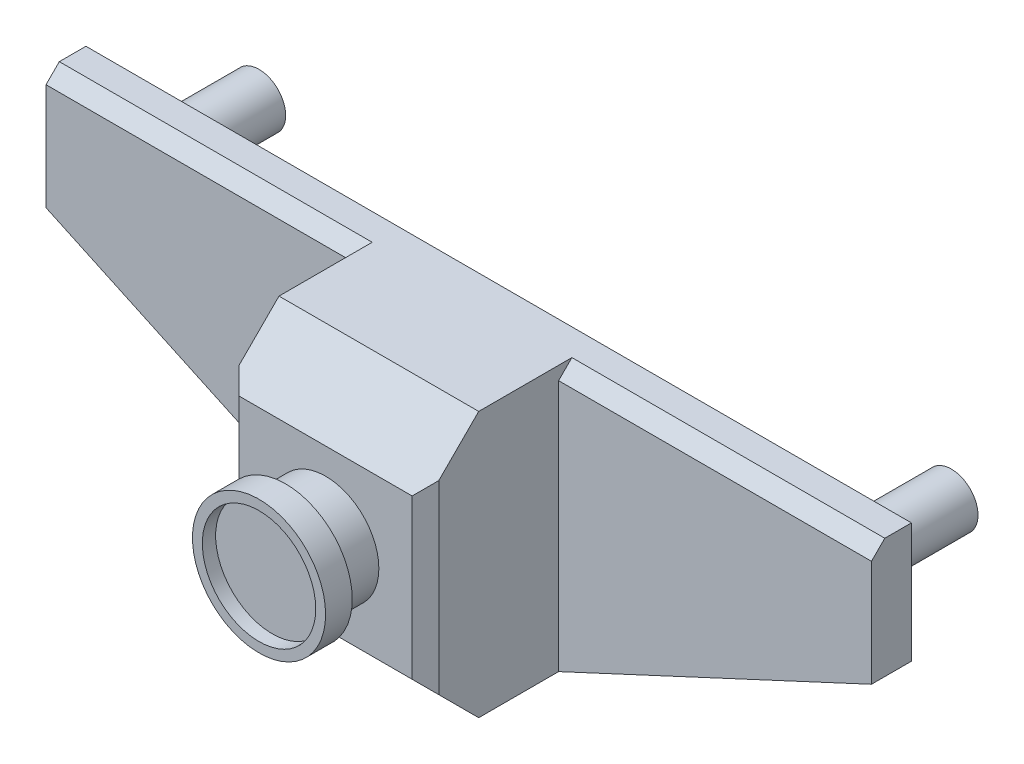
ISO-10303-21;
HEADER;
FILE_DESCRIPTION(('STEP AP214'),'2;1');
FILE_NAME('part.step','',(''),(''),'','','');
FILE_SCHEMA(('AUTOMOTIVE_DESIGN { 1 0 10303 214 1 1 1 1 }'));
ENDSEC;
DATA;
#1=APPLICATION_CONTEXT('core data for automotive mechanical design processes');
#2=APPLICATION_PROTOCOL_DEFINITION('international standard','automotive_design',2000,#1);
#3=PRODUCT_CONTEXT('',#1,'mechanical');
#4=PRODUCT('Part','Part','',(#3));
#5=PRODUCT_RELATED_PRODUCT_CATEGORY('part','',(#4));
#6=PRODUCT_DEFINITION_FORMATION('','',#4);
#7=PRODUCT_DEFINITION_CONTEXT('part definition',#1,'design');
#8=PRODUCT_DEFINITION('design','',#6,#7);
#9=PRODUCT_DEFINITION_SHAPE('','',#8);
#10=(LENGTH_UNIT() NAMED_UNIT(*) SI_UNIT(.MILLI.,.METRE.));
#11=(NAMED_UNIT(*) PLANE_ANGLE_UNIT() SI_UNIT($,.RADIAN.));
#12=(NAMED_UNIT(*) SI_UNIT($,.STERADIAN.) SOLID_ANGLE_UNIT());
#13=UNCERTAINTY_MEASURE_WITH_UNIT(LENGTH_MEASURE(1.E-05),#10,'distance_accuracy_value','');
#14=(GEOMETRIC_REPRESENTATION_CONTEXT(3) GLOBAL_UNCERTAINTY_ASSIGNED_CONTEXT((#13)) GLOBAL_UNIT_ASSIGNED_CONTEXT((#10,
#11,#12)) REPRESENTATION_CONTEXT('',''));
#15=CARTESIAN_POINT('',(0.,0.,0.));
#16=DIRECTION('',(0.,0.,1.));
#17=DIRECTION('',(1.,0.,0.));
#18=AXIS2_PLACEMENT_3D('',#15,#16,#17);
#19=CARTESIAN_POINT('',(0.,0.,3.));
#20=DIRECTION('',(0.,0.,1.));
#21=DIRECTION('',(1.,0.,0.));
#22=AXIS2_PLACEMENT_3D('',#19,#20,#21);
#23=PLANE('',#22);
#24=DIRECTION('',(0.,-1.,0.));
#25=VECTOR('',#24,1.);
#26=CARTESIAN_POINT('',(7.98924665609624,-14.2222222222222,3.));
#27=LINE('',#26,#25);
#28=CARTESIAN_POINT('',(7.98924665609624,4.70370370370372,3.));
#29=VERTEX_POINT('',#28);
#30=CARTESIAN_POINT('',(7.98924665609624,-14.2222222222222,3.));
#31=VERTEX_POINT('',#30);
#32=EDGE_CURVE('E237',#29,#31,#27,.T.);
#33=ORIENTED_EDGE('',*,*,#32,.F.);
#34=DIRECTION('',(-1.,0.,0.));
#35=VECTOR('',#34,1.);
#36=CARTESIAN_POINT('',(-15.5107533439038,4.70370370370372,3.));
#37=LINE('',#36,#35);
#38=CARTESIAN_POINT('',(-15.5107533439038,4.70370370370372,3.));
#39=VERTEX_POINT('',#38);
#40=EDGE_CURVE('E156',#29,#39,#37,.T.);
#41=ORIENTED_EDGE('',*,*,#40,.T.);
#42=DIRECTION('',(0.,-1.,0.));
#43=VECTOR('',#42,1.);
#44=CARTESIAN_POINT('',(-15.5107533439038,5.70370370370371,3.));
#45=LINE('',#44,#43);
#46=CARTESIAN_POINT('',(-15.5107533439038,-3.29629629629629,3.));
#47=VERTEX_POINT('',#46);
#48=EDGE_CURVE('E150',#39,#47,#45,.T.);
#49=ORIENTED_EDGE('',*,*,#48,.T.);
#50=DIRECTION('',(0.906784646843196,-0.421594122645774,0.));
#51=VECTOR('',#50,1.);
#52=CARTESIAN_POINT('',(-15.5107533439038,-3.29629629629629,3.));
#53=LINE('',#52,#51);
#54=EDGE_CURVE('E153',#47,#31,#53,.T.);
#55=ORIENTED_EDGE('',*,*,#54,.T.);
#56=EDGE_LOOP('',(#33,#41,#49,#55));
#57=FACE_BOUND('',#56,.T.);
#58=ADVANCED_FACE('F39',(#57),#23,.T.);
#59=CARTESIAN_POINT('',(-15.5107533439038,5.70370370370371,3.));
#60=DIRECTION('',(1.,0.,0.));
#61=DIRECTION('',(0.,0.,-1.));
#62=AXIS2_PLACEMENT_3D('',#59,#60,#61);
#63=PLANE('',#62);
#64=ORIENTED_EDGE('',*,*,#48,.F.);
#65=DIRECTION('',(0.,0.707106781186545,-0.70710678118655));
#66=VECTOR('',#65,1.);
#67=CARTESIAN_POINT('',(-15.5107533439038,4.70370370370372,3.));
#68=LINE('',#67,#66);
#69=CARTESIAN_POINT('',(-15.5107533439038,5.70370370370371,2.));
#70=VERTEX_POINT('',#69);
#71=EDGE_CURVE('E224',#39,#70,#68,.T.);
#72=ORIENTED_EDGE('',*,*,#71,.T.);
#73=DIRECTION('',(0.,0.,-1.));
#74=VECTOR('',#73,1.);
#75=CARTESIAN_POINT('',(-15.5107533439038,5.70370370370371,3.));
#76=LINE('',#75,#74);
#77=CARTESIAN_POINT('',(-15.5107533439038,5.70370370370371,0.));
#78=VERTEX_POINT('',#77);
#79=EDGE_CURVE('E248',#70,#78,#76,.T.);
#80=ORIENTED_EDGE('',*,*,#79,.T.);
#81=DIRECTION('',(0.,-1.,0.));
#82=VECTOR('',#81,1.);
#83=CARTESIAN_POINT('',(-15.5107533439038,5.70370370370371,0.));
#84=LINE('',#83,#82);
#85=CARTESIAN_POINT('',(-15.5107533439038,-3.29629629629629,0.));
#86=VERTEX_POINT('',#85);
#87=EDGE_CURVE('E172',#78,#86,#84,.T.);
#88=ORIENTED_EDGE('',*,*,#87,.T.);
#89=DIRECTION('',(0.,0.,-1.));
#90=VECTOR('',#89,1.);
#91=CARTESIAN_POINT('',(-15.5107533439038,-3.29629629629629,3.));
#92=LINE('',#91,#90);
#93=EDGE_CURVE('E164',#47,#86,#92,.T.);
#94=ORIENTED_EDGE('',*,*,#93,.F.);
#95=EDGE_LOOP('',(#64,#72,#80,#88,#94));
#96=FACE_BOUND('',#95,.T.);
#97=ADVANCED_FACE('F170',(#96),#63,.F.);
#98=CARTESIAN_POINT('',(-15.5107533439038,-3.29629629629629,3.));
#99=DIRECTION('',(0.421594122645774,0.906784646843196,0.));
#100=DIRECTION('',(-0.906784646843196,0.421594122645774,0.));
#101=AXIS2_PLACEMENT_3D('',#98,#99,#100);
#102=PLANE('',#101);
#103=DIRECTION('',(0.906784646843196,-0.421594122645774,0.));
#104=VECTOR('',#103,1.);
#105=CARTESIAN_POINT('',(-15.5107533439038,-3.29629629629629,0.));
#106=LINE('',#105,#104);
#107=CARTESIAN_POINT('',(7.98924665609624,-14.2222222222222,0.));
#108=VERTEX_POINT('',#107);
#109=EDGE_CURVE('E281',#86,#108,#106,.T.);
#110=ORIENTED_EDGE('',*,*,#109,.T.);
#111=DIRECTION('',(0.,0.,-1.));
#112=VECTOR('',#111,1.);
#113=CARTESIAN_POINT('',(7.98924665609624,-14.2222222222222,3.));
#114=LINE('',#113,#112);
#115=EDGE_CURVE('E167',#31,#108,#114,.T.);
#116=ORIENTED_EDGE('',*,*,#115,.F.);
#117=ORIENTED_EDGE('',*,*,#54,.F.);
#118=ORIENTED_EDGE('',*,*,#93,.T.);
#119=EDGE_LOOP('',(#110,#116,#117,#118));
#120=FACE_BOUND('',#119,.T.);
#121=ADVANCED_FACE('F163',(#120),#102,.F.);
#122=CARTESIAN_POINT('',(7.98924665609624,-14.2222222222222,3.));
#123=DIRECTION('',(0.,1.,0.));
#124=DIRECTION('',(-1.,0.,0.));
#125=AXIS2_PLACEMENT_3D('',#122,#123,#124);
#126=PLANE('',#125);
#127=DIRECTION('',(0.,0.,-1.));
#128=VECTOR('',#127,1.);
#129=CARTESIAN_POINT('',(22.9892466560962,-14.2222222222222,13.));
#130=LINE('',#129,#128);
#131=CARTESIAN_POINT('',(22.9892466560962,-14.2222222222222,9.00000000000001));
#132=VERTEX_POINT('',#131);
#133=CARTESIAN_POINT('',(22.9892466560962,-14.2222222222222,3.));
#134=VERTEX_POINT('',#133);
#135=EDGE_CURVE('E295',#132,#134,#130,.T.);
#136=ORIENTED_EDGE('',*,*,#135,.F.);
#137=DIRECTION('',(-1.,0.,0.));
#138=VECTOR('',#137,1.);
#139=CARTESIAN_POINT('',(7.98924665609624,-14.2222222222222,9.00000000000001));
#140=LINE('',#139,#138);
#141=CARTESIAN_POINT('',(7.98924665609624,-14.2222222222222,9.00000000000001));
#142=VERTEX_POINT('',#141);
#143=EDGE_CURVE('E195',#132,#142,#140,.T.);
#144=ORIENTED_EDGE('',*,*,#143,.T.);
#145=DIRECTION('',(0.,0.,-1.));
#146=VECTOR('',#145,1.);
#147=CARTESIAN_POINT('',(7.98924665609624,-14.2222222222222,13.));
#148=LINE('',#147,#146);
#149=EDGE_CURVE('E293',#142,#31,#148,.T.);
#150=ORIENTED_EDGE('',*,*,#149,.T.);
#151=ORIENTED_EDGE('',*,*,#115,.T.);
#152=DIRECTION('',(1.,0.,0.));
#153=VECTOR('',#152,1.);
#154=CARTESIAN_POINT('',(7.98924665609624,-14.2222222222222,0.));
#155=LINE('',#154,#153);
#156=CARTESIAN_POINT('',(22.9892466560962,-14.2222222222222,0.));
#157=VERTEX_POINT('',#156);
#158=EDGE_CURVE('E277',#108,#157,#155,.T.);
#159=ORIENTED_EDGE('',*,*,#158,.T.);
#160=DIRECTION('',(0.,0.,-1.));
#161=VECTOR('',#160,1.);
#162=CARTESIAN_POINT('',(22.9892466560962,-14.2222222222222,3.));
#163=LINE('',#162,#161);
#164=EDGE_CURVE('E178',#134,#157,#163,.T.);
#165=ORIENTED_EDGE('',*,*,#164,.F.);
#166=EDGE_LOOP('',(#136,#144,#150,#151,#159,#165));
#167=FACE_BOUND('',#166,.T.);
#168=ADVANCED_FACE('F367',(#167),#126,.F.);
#169=CARTESIAN_POINT('',(22.9892466560962,-14.2222222222222,3.));
#170=DIRECTION('',(-0.421594122645774,0.906784646843196,0.));
#171=DIRECTION('',(-0.906784646843196,-0.421594122645774,0.));
#172=AXIS2_PLACEMENT_3D('',#169,#170,#171);
#173=PLANE('',#172);
#174=DIRECTION('',(0.906784646843196,0.421594122645774,0.));
#175=VECTOR('',#174,1.);
#176=CARTESIAN_POINT('',(22.9892466560962,-14.2222222222222,0.));
#177=LINE('',#176,#175);
#178=CARTESIAN_POINT('',(46.4892466560962,-3.29629629629629,0.));
#179=VERTEX_POINT('',#178);
#180=EDGE_CURVE('E270',#157,#179,#177,.T.);
#181=ORIENTED_EDGE('',*,*,#180,.T.);
#182=DIRECTION('',(0.,0.,-1.));
#183=VECTOR('',#182,1.);
#184=CARTESIAN_POINT('',(46.4892466560962,-3.29629629629629,3.));
#185=LINE('',#184,#183);
#186=CARTESIAN_POINT('',(46.4892466560962,-3.29629629629629,3.));
#187=VERTEX_POINT('',#186);
#188=EDGE_CURVE('E256',#187,#179,#185,.T.);
#189=ORIENTED_EDGE('',*,*,#188,.F.);
#190=DIRECTION('',(0.906784646843196,0.421594122645774,0.));
#191=VECTOR('',#190,1.);
#192=CARTESIAN_POINT('',(22.9892466560962,-14.2222222222222,3.));
#193=LINE('',#192,#191);
#194=EDGE_CURVE('E168',#134,#187,#193,.T.);
#195=ORIENTED_EDGE('',*,*,#194,.F.);
#196=ORIENTED_EDGE('',*,*,#164,.T.);
#197=EDGE_LOOP('',(#181,#189,#195,#196));
#198=FACE_BOUND('',#197,.T.);
#199=ADVANCED_FACE('F268',(#198),#173,.F.);
#200=CARTESIAN_POINT('',(46.4892466560962,5.70370370370371,3.));
#201=DIRECTION('',(-1.,0.,0.));
#202=DIRECTION('',(0.,0.,1.));
#203=AXIS2_PLACEMENT_3D('',#200,#201,#202);
#204=PLANE('',#203);
#205=DIRECTION('',(0.,0.,-1.));
#206=VECTOR('',#205,1.);
#207=CARTESIAN_POINT('',(46.4892466560962,5.70370370370371,3.));
#208=LINE('',#207,#206);
#209=CARTESIAN_POINT('',(46.4892466560962,5.70370370370371,2.));
#210=VERTEX_POINT('',#209);
#211=CARTESIAN_POINT('',(46.4892466560962,5.70370370370371,0.));
#212=VERTEX_POINT('',#211);
#213=EDGE_CURVE('E253',#210,#212,#208,.T.);
#214=ORIENTED_EDGE('',*,*,#213,.F.);
#215=DIRECTION('',(0.,-0.707106781186545,0.70710678118655));
#216=VECTOR('',#215,1.);
#217=CARTESIAN_POINT('',(46.4892466560962,4.70370370370372,3.));
#218=LINE('',#217,#216);
#219=CARTESIAN_POINT('',(46.4892466560962,4.70370370370372,3.));
#220=VERTEX_POINT('',#219);
#221=EDGE_CURVE('E55',#210,#220,#218,.T.);
#222=ORIENTED_EDGE('',*,*,#221,.T.);
#223=DIRECTION('',(0.,1.,0.));
#224=VECTOR('',#223,1.);
#225=CARTESIAN_POINT('',(46.4892466560962,5.70370370370371,3.));
#226=LINE('',#225,#224);
#227=EDGE_CURVE('E254',#187,#220,#226,.T.);
#228=ORIENTED_EDGE('',*,*,#227,.F.);
#229=ORIENTED_EDGE('',*,*,#188,.T.);
#230=DIRECTION('',(0.,1.,0.));
#231=VECTOR('',#230,1.);
#232=CARTESIAN_POINT('',(46.4892466560962,5.70370370370371,0.));
#233=LINE('',#232,#231);
#234=EDGE_CURVE('E279',#179,#212,#233,.T.);
#235=ORIENTED_EDGE('',*,*,#234,.T.);
#236=EDGE_LOOP('',(#214,#222,#228,#229,#235));
#237=FACE_BOUND('',#236,.T.);
#238=ADVANCED_FACE('F363',(#237),#204,.F.);
#239=CARTESIAN_POINT('',(-15.5107533439038,5.70370370370371,3.));
#240=DIRECTION('',(0.,-1.,0.));
#241=DIRECTION('',(0.,0.,-1.));
#242=AXIS2_PLACEMENT_3D('',#239,#240,#241);
#243=PLANE('',#242);
#244=ORIENTED_EDGE('',*,*,#79,.F.);
#245=DIRECTION('',(1.,0.,0.));
#246=VECTOR('',#245,1.);
#247=CARTESIAN_POINT('',(7.98924665609624,5.70370370370371,2.));
#248=LINE('',#247,#246);
#249=CARTESIAN_POINT('',(7.98924665609624,5.70370370370371,2.));
#250=VERTEX_POINT('',#249);
#251=EDGE_CURVE('E228',#70,#250,#248,.T.);
#252=ORIENTED_EDGE('',*,*,#251,.T.);
#253=DIRECTION('',(0.,0.,-1.));
#254=VECTOR('',#253,1.);
#255=CARTESIAN_POINT('',(7.98924665609624,5.70370370370371,13.));
#256=LINE('',#255,#254);
#257=CARTESIAN_POINT('',(7.98924665609624,5.70370370370371,9.00000000000001));
#258=VERTEX_POINT('',#257);
#259=EDGE_CURVE('E240',#258,#250,#256,.T.);
#260=ORIENTED_EDGE('',*,*,#259,.F.);
#261=DIRECTION('',(1.,0.,0.));
#262=VECTOR('',#261,1.);
#263=CARTESIAN_POINT('',(-15.5107533439038,5.70370370370371,9.00000000000001));
#264=LINE('',#263,#262);
#265=CARTESIAN_POINT('',(22.9892466560962,5.70370370370371,9.00000000000001));
#266=VERTEX_POINT('',#265);
#267=EDGE_CURVE('E202',#258,#266,#264,.T.);
#268=ORIENTED_EDGE('',*,*,#267,.T.);
#269=DIRECTION('',(0.,0.,-1.));
#270=VECTOR('',#269,1.);
#271=CARTESIAN_POINT('',(22.9892466560962,5.70370370370371,13.));
#272=LINE('',#271,#270);
#273=CARTESIAN_POINT('',(22.9892466560962,5.70370370370371,2.));
#274=VERTEX_POINT('',#273);
#275=EDGE_CURVE('E297',#266,#274,#272,.T.);
#276=ORIENTED_EDGE('',*,*,#275,.T.);
#277=DIRECTION('',(1.,0.,0.));
#278=VECTOR('',#277,1.);
#279=CARTESIAN_POINT('',(46.4892466560962,5.70370370370371,2.));
#280=LINE('',#279,#278);
#281=EDGE_CURVE('E226',#274,#210,#280,.T.);
#282=ORIENTED_EDGE('',*,*,#281,.T.);
#283=ORIENTED_EDGE('',*,*,#213,.T.);
#284=DIRECTION('',(-1.,0.,0.));
#285=VECTOR('',#284,1.);
#286=CARTESIAN_POINT('',(-15.5107533439038,5.70370370370371,0.));
#287=LINE('',#286,#285);
#288=EDGE_CURVE('E159',#212,#78,#287,.T.);
#289=ORIENTED_EDGE('',*,*,#288,.T.);
#290=EDGE_LOOP('',(#244,#252,#260,#268,#276,#282,#283,#289));
#291=FACE_BOUND('',#290,.T.);
#292=ADVANCED_FACE('F251',(#291),#243,.F.);
#293=ORIENTED_EDGE('',*,*,#227,.T.);
#294=DIRECTION('',(-1.,0.,0.));
#295=VECTOR('',#294,1.);
#296=CARTESIAN_POINT('',(22.9892466560962,4.70370370370372,3.));
#297=LINE('',#296,#295);
#298=CARTESIAN_POINT('',(22.9892466560962,4.70370370370372,3.));
#299=VERTEX_POINT('',#298);
#300=EDGE_CURVE('E231',#220,#299,#297,.T.);
#301=ORIENTED_EDGE('',*,*,#300,.T.);
#302=DIRECTION('',(0.,1.,0.));
#303=VECTOR('',#302,1.);
#304=CARTESIAN_POINT('',(22.9892466560962,-14.2222222222222,3.));
#305=LINE('',#304,#303);
#306=EDGE_CURVE('E243',#134,#299,#305,.T.);
#307=ORIENTED_EDGE('',*,*,#306,.F.);
#308=ORIENTED_EDGE('',*,*,#194,.T.);
#309=EDGE_LOOP('',(#293,#301,#307,#308));
#310=FACE_BOUND('',#309,.T.);
#311=ADVANCED_FACE('F348',(#310),#23,.T.);
#312=CARTESIAN_POINT('',(0.,0.,0.));
#313=DIRECTION('',(0.,0.,1.));
#314=DIRECTION('',(1.,0.,0.));
#315=AXIS2_PLACEMENT_3D('',#312,#313,#314);
#316=PLANE('',#315);
#317=CARTESIAN_POINT('',(-10.5107533439038,0.703703703703711,0.));
#318=DIRECTION('',(0.,0.,1.));
#319=DIRECTION('',(1.,0.,0.));
#320=AXIS2_PLACEMENT_3D('',#317,#318,#319);
#321=CIRCLE('',#320,2.);
#322=CARTESIAN_POINT('',(-8.51075334390375,0.703703703703711,0.));
#323=VERTEX_POINT('',#322);
#324=EDGE_CURVE('E176',#323,#323,#321,.F.);
#325=ORIENTED_EDGE('',*,*,#324,.F.);
#326=EDGE_LOOP('',(#325));
#327=FACE_BOUND('',#326,.T.);
#328=CARTESIAN_POINT('',(41.4892466560962,0.703703703703711,0.));
#329=DIRECTION('',(0.,0.,1.));
#330=DIRECTION('',(1.,0.,0.));
#331=AXIS2_PLACEMENT_3D('',#328,#329,#330);
#332=CIRCLE('',#331,2.);
#333=CARTESIAN_POINT('',(43.4892466560962,0.703703703703711,0.));
#334=VERTEX_POINT('',#333);
#335=EDGE_CURVE('E173',#334,#334,#332,.F.);
#336=ORIENTED_EDGE('',*,*,#335,.F.);
#337=EDGE_LOOP('',(#336));
#338=FACE_BOUND('',#337,.T.);
#339=ORIENTED_EDGE('',*,*,#87,.F.);
#340=ORIENTED_EDGE('',*,*,#288,.F.);
#341=ORIENTED_EDGE('',*,*,#234,.F.);
#342=ORIENTED_EDGE('',*,*,#180,.F.);
#343=ORIENTED_EDGE('',*,*,#158,.F.);
#344=ORIENTED_EDGE('',*,*,#109,.F.);
#345=EDGE_LOOP('',(#339,#340,#341,#342,#343,#344));
#346=FACE_BOUND('',#345,.T.);
#347=ADVANCED_FACE('F276',(#327,#338,#346),#316,.F.);
#348=CARTESIAN_POINT('',(41.4892466560962,0.703703703703711,-8.));
#349=DIRECTION('',(0.,0.,1.));
#350=DIRECTION('',(1.,0.,0.));
#351=AXIS2_PLACEMENT_3D('',#348,#349,#350);
#352=CYLINDRICAL_SURFACE('',#351,2.);
#353=CARTESIAN_POINT('',(41.4892466560962,0.703703703703711,-8.));
#354=DIRECTION('',(0.,0.,-1.));
#355=DIRECTION('',(-1.,0.,0.));
#356=AXIS2_PLACEMENT_3D('',#353,#354,#355);
#357=CIRCLE('',#356,2.);
#358=CARTESIAN_POINT('',(39.4892466560962,0.703703703703711,-8.));
#359=VERTEX_POINT('',#358);
#360=EDGE_CURVE('E285',#359,#359,#357,.T.);
#361=ORIENTED_EDGE('',*,*,#360,.F.);
#362=EDGE_LOOP('',(#361));
#363=FACE_BOUND('',#362,.T.);
#364=ORIENTED_EDGE('',*,*,#335,.T.);
#365=EDGE_LOOP('',(#364));
#366=FACE_BOUND('',#365,.T.);
#367=ADVANCED_FACE('F361',(#363,#366),#352,.T.);
#368=CARTESIAN_POINT('',(41.4892466560962,0.703703703703711,-8.));
#369=DIRECTION('',(0.,0.,-1.));
#370=DIRECTION('',(-1.,0.,0.));
#371=AXIS2_PLACEMENT_3D('',#368,#369,#370);
#372=PLANE('',#371);
#373=ORIENTED_EDGE('',*,*,#360,.T.);
#374=EDGE_LOOP('',(#373));
#375=FACE_BOUND('',#374,.T.);
#376=ADVANCED_FACE('F535',(#375),#372,.T.);
#377=CARTESIAN_POINT('',(-10.5107533439038,0.703703703703711,-8.));
#378=DIRECTION('',(0.,0.,1.));
#379=DIRECTION('',(1.,0.,0.));
#380=AXIS2_PLACEMENT_3D('',#377,#378,#379);
#381=CYLINDRICAL_SURFACE('',#380,2.);
#382=CARTESIAN_POINT('',(-10.5107533439038,0.703703703703711,-8.));
#383=DIRECTION('',(0.,0.,-1.));
#384=DIRECTION('',(-1.,0.,0.));
#385=AXIS2_PLACEMENT_3D('',#382,#383,#384);
#386=CIRCLE('',#385,2.);
#387=CARTESIAN_POINT('',(-12.5107533439038,0.703703703703711,-8.));
#388=VERTEX_POINT('',#387);
#389=EDGE_CURVE('E290',#388,#388,#386,.T.);
#390=ORIENTED_EDGE('',*,*,#389,.F.);
#391=EDGE_LOOP('',(#390));
#392=FACE_BOUND('',#391,.T.);
#393=ORIENTED_EDGE('',*,*,#324,.T.);
#394=EDGE_LOOP('',(#393));
#395=FACE_BOUND('',#394,.T.);
#396=ADVANCED_FACE('F524',(#392,#395),#381,.T.);
#397=CARTESIAN_POINT('',(-10.5107533439038,0.703703703703711,-8.));
#398=DIRECTION('',(0.,0.,-1.));
#399=DIRECTION('',(-1.,0.,0.));
#400=AXIS2_PLACEMENT_3D('',#397,#398,#399);
#401=PLANE('',#400);
#402=ORIENTED_EDGE('',*,*,#389,.T.);
#403=EDGE_LOOP('',(#402));
#404=FACE_BOUND('',#403,.T.);
#405=ADVANCED_FACE('F519',(#404),#401,.T.);
#406=CARTESIAN_POINT('',(7.98924665609624,-14.2222222222222,13.));
#407=DIRECTION('',(1.,0.,0.));
#408=DIRECTION('',(0.,0.,-1.));
#409=AXIS2_PLACEMENT_3D('',#406,#407,#408);
#410=PLANE('',#409);
#411=DIRECTION('',(0.,-0.707106781186547,-0.707106781186548));
#412=VECTOR('',#411,1.);
#413=CARTESIAN_POINT('',(7.98924665609624,-10.2222222222222,13.));
#414=LINE('',#413,#412);
#415=CARTESIAN_POINT('',(7.98924665609624,-11.2222222222223,12.));
#416=VERTEX_POINT('',#415);
#417=EDGE_CURVE('E199',#142,#416,#414,.F.);
#418=ORIENTED_EDGE('',*,*,#417,.T.);
#419=DIRECTION('',(0.,1.,0.));
#420=VECTOR('',#419,1.);
#421=CARTESIAN_POINT('',(7.98924665609624,-14.2222222222222,12.));
#422=LINE('',#421,#420);
#423=CARTESIAN_POINT('',(7.98924665609624,2.70370370370373,12.));
#424=VERTEX_POINT('',#423);
#425=EDGE_CURVE('E220',#416,#424,#422,.T.);
#426=ORIENTED_EDGE('',*,*,#425,.T.);
#427=DIRECTION('',(0.,-0.707106781186547,0.707106781186548));
#428=VECTOR('',#427,1.);
#429=CARTESIAN_POINT('',(7.98924665609624,1.70370370370372,13.));
#430=LINE('',#429,#428);
#431=EDGE_CURVE('E197',#424,#258,#430,.F.);
#432=ORIENTED_EDGE('',*,*,#431,.T.);
#433=ORIENTED_EDGE('',*,*,#259,.T.);
#434=DIRECTION('',(0.,-0.707106781186545,0.70710678118655));
#435=VECTOR('',#434,1.);
#436=CARTESIAN_POINT('',(7.98924665609624,-9.7592592592592,17.462962962963));
#437=LINE('',#436,#435);
#438=EDGE_CURVE('E48',#250,#29,#437,.T.);
#439=ORIENTED_EDGE('',*,*,#438,.T.);
#440=ORIENTED_EDGE('',*,*,#32,.T.);
#441=ORIENTED_EDGE('',*,*,#149,.F.);
#442=EDGE_LOOP('',(#418,#426,#432,#433,#439,#440,#441));
#443=FACE_BOUND('',#442,.T.);
#444=ADVANCED_FACE('F235',(#443),#410,.F.);
#445=CARTESIAN_POINT('',(22.9892466560962,-14.2222222222222,13.));
#446=DIRECTION('',(-1.,0.,0.));
#447=DIRECTION('',(0.,0.,1.));
#448=AXIS2_PLACEMENT_3D('',#445,#446,#447);
#449=PLANE('',#448);
#450=DIRECTION('',(0.,0.707106781186547,-0.707106781186548));
#451=VECTOR('',#450,1.);
#452=CARTESIAN_POINT('',(22.9892466560962,1.70370370370372,13.));
#453=LINE('',#452,#451);
#454=CARTESIAN_POINT('',(22.9892466560962,2.70370370370373,12.));
#455=VERTEX_POINT('',#454);
#456=EDGE_CURVE('E190',#266,#455,#453,.F.);
#457=ORIENTED_EDGE('',*,*,#456,.T.);
#458=DIRECTION('',(0.,-1.,0.));
#459=VECTOR('',#458,1.);
#460=CARTESIAN_POINT('',(22.9892466560962,-14.2222222222222,12.));
#461=LINE('',#460,#459);
#462=CARTESIAN_POINT('',(22.9892466560962,-11.2222222222223,12.));
#463=VERTEX_POINT('',#462);
#464=EDGE_CURVE('E214',#455,#463,#461,.T.);
#465=ORIENTED_EDGE('',*,*,#464,.T.);
#466=DIRECTION('',(0.,0.707106781186547,0.707106781186548));
#467=VECTOR('',#466,1.);
#468=CARTESIAN_POINT('',(22.9892466560962,-10.2222222222222,13.));
#469=LINE('',#468,#467);
#470=EDGE_CURVE('E193',#463,#132,#469,.F.);
#471=ORIENTED_EDGE('',*,*,#470,.T.);
#472=ORIENTED_EDGE('',*,*,#135,.T.);
#473=ORIENTED_EDGE('',*,*,#306,.T.);
#474=DIRECTION('',(0.,0.707106781186545,-0.70710678118655));
#475=VECTOR('',#474,1.);
#476=CARTESIAN_POINT('',(22.9892466560962,-9.7592592592592,17.462962962963));
#477=LINE('',#476,#475);
#478=EDGE_CURVE('E11',#299,#274,#477,.T.);
#479=ORIENTED_EDGE('',*,*,#478,.T.);
#480=ORIENTED_EDGE('',*,*,#275,.F.);
#481=EDGE_LOOP('',(#457,#465,#471,#472,#473,#479,#480));
#482=FACE_BOUND('',#481,.T.);
#483=ADVANCED_FACE('F389',(#482),#449,.F.);
#484=CARTESIAN_POINT('',(0.,0.,13.));
#485=DIRECTION('',(0.,0.,-1.));
#486=DIRECTION('',(-1.,0.,0.));
#487=AXIS2_PLACEMENT_3D('',#484,#485,#486);
#488=PLANE('',#487);
#489=CARTESIAN_POINT('',(15.4892466560962,-4.25925925925926,13.));
#490=DIRECTION('',(0.,0.,1.));
#491=DIRECTION('',(1.,0.,0.));
#492=AXIS2_PLACEMENT_3D('',#489,#490,#491);
#493=CIRCLE('',#492,4.);
#494=CARTESIAN_POINT('',(19.4892466560962,-4.25925925925926,13.));
#495=VERTEX_POINT('',#494);
#496=EDGE_CURVE('E222',#495,#495,#493,.T.);
#497=ORIENTED_EDGE('',*,*,#496,.F.);
#498=EDGE_LOOP('',(#497));
#499=FACE_BOUND('',#498,.T.);
#500=DIRECTION('',(1.,0.,0.));
#501=VECTOR('',#500,1.);
#502=CARTESIAN_POINT('',(0.,-10.2222222222222,13.));
#503=LINE('',#502,#501);
#504=CARTESIAN_POINT('',(8.98924665609625,-10.2222222222222,13.));
#505=VERTEX_POINT('',#504);
#506=CARTESIAN_POINT('',(21.9892466560962,-10.2222222222222,13.));
#507=VERTEX_POINT('',#506);
#508=EDGE_CURVE('E187',#505,#507,#503,.T.);
#509=ORIENTED_EDGE('',*,*,#508,.T.);
#510=DIRECTION('',(0.,1.,0.));
#511=VECTOR('',#510,1.);
#512=CARTESIAN_POINT('',(21.9892466560962,0.,13.));
#513=LINE('',#512,#511);
#514=CARTESIAN_POINT('',(21.9892466560962,1.70370370370372,13.));
#515=VERTEX_POINT('',#514);
#516=EDGE_CURVE('E207',#507,#515,#513,.T.);
#517=ORIENTED_EDGE('',*,*,#516,.T.);
#518=DIRECTION('',(-1.,0.,0.));
#519=VECTOR('',#518,1.);
#520=CARTESIAN_POINT('',(0.,1.70370370370372,13.));
#521=LINE('',#520,#519);
#522=CARTESIAN_POINT('',(8.98924665609625,1.70370370370372,13.));
#523=VERTEX_POINT('',#522);
#524=EDGE_CURVE('E184',#515,#523,#521,.T.);
#525=ORIENTED_EDGE('',*,*,#524,.T.);
#526=DIRECTION('',(0.,-1.,0.));
#527=VECTOR('',#526,1.);
#528=CARTESIAN_POINT('',(8.98924665609625,0.,13.));
#529=LINE('',#528,#527);
#530=EDGE_CURVE('E204',#523,#505,#529,.T.);
#531=ORIENTED_EDGE('',*,*,#530,.T.);
#532=EDGE_LOOP('',(#509,#517,#525,#531));
#533=FACE_BOUND('',#532,.T.);
#534=ADVANCED_FACE('F380',(#499,#533),#488,.F.);
#535=CARTESIAN_POINT('',(0.,-10.2222222222222,13.));
#536=DIRECTION('',(0.,0.707106781186548,-0.707106781186547));
#537=DIRECTION('',(1.,0.,0.));
#538=AXIS2_PLACEMENT_3D('',#535,#536,#537);
#539=PLANE('',#538);
#540=ORIENTED_EDGE('',*,*,#470,.F.);
#541=DIRECTION('',(-0.577350269189626,0.577350269189625,0.577350269189626));
#542=VECTOR('',#541,1.);
#543=CARTESIAN_POINT('',(14.6594977707308,-2.89247333685684,20.3297488853654));
#544=LINE('',#543,#542);
#545=EDGE_CURVE('E218',#463,#507,#544,.T.);
#546=ORIENTED_EDGE('',*,*,#545,.T.);
#547=ORIENTED_EDGE('',*,*,#508,.F.);
#548=DIRECTION('',(-0.577350269189626,-0.577350269189625,-0.577350269189626));
#549=VECTOR('',#548,1.);
#550=CARTESIAN_POINT('',(5.99283110406416,-13.2186377742543,10.0035844479679));
#551=LINE('',#550,#549);
#552=EDGE_CURVE('E216',#505,#416,#551,.T.);
#553=ORIENTED_EDGE('',*,*,#552,.T.);
#554=ORIENTED_EDGE('',*,*,#417,.F.);
#555=ORIENTED_EDGE('',*,*,#143,.F.);
#556=EDGE_LOOP('',(#540,#546,#547,#553,#554,#555));
#557=FACE_BOUND('',#556,.T.);
#558=ADVANCED_FACE('F373',(#557),#539,.F.);
#559=CARTESIAN_POINT('',(0.,1.70370370370372,13.));
#560=DIRECTION('',(0.,-0.707106781186548,-0.707106781186547));
#561=DIRECTION('',(-1.,0.,0.));
#562=AXIS2_PLACEMENT_3D('',#559,#560,#561);
#563=PLANE('',#562);
#564=ORIENTED_EDGE('',*,*,#524,.F.);
#565=DIRECTION('',(0.577350269189626,0.577350269189625,-0.577350269189626));
#566=VECTOR('',#565,1.);
#567=CARTESIAN_POINT('',(14.6594977707308,-5.62604518166168,20.3297488853654));
#568=LINE('',#567,#566);
#569=EDGE_CURVE('E212',#515,#455,#568,.T.);
#570=ORIENTED_EDGE('',*,*,#569,.T.);
#571=ORIENTED_EDGE('',*,*,#456,.F.);
#572=ORIENTED_EDGE('',*,*,#267,.F.);
#573=ORIENTED_EDGE('',*,*,#431,.F.);
#574=DIRECTION('',(0.577350269189626,-0.577350269189625,0.577350269189626));
#575=VECTOR('',#574,1.);
#576=CARTESIAN_POINT('',(5.99283110406416,4.7001192557358,10.0035844479679));
#577=LINE('',#576,#575);
#578=EDGE_CURVE('E210',#424,#523,#577,.T.);
#579=ORIENTED_EDGE('',*,*,#578,.T.);
#580=EDGE_LOOP('',(#564,#570,#571,#572,#573,#579));
#581=FACE_BOUND('',#580,.T.);
#582=ADVANCED_FACE('F384',(#581),#563,.F.);
#583=CARTESIAN_POINT('',(21.9892466560962,0.,13.));
#584=DIRECTION('',(-0.707106781186547,0.,-0.707106781186547));
#585=DIRECTION('',(0.,1.,0.));
#586=AXIS2_PLACEMENT_3D('',#583,#584,#585);
#587=PLANE('',#586);
#588=ORIENTED_EDGE('',*,*,#545,.F.);
#589=ORIENTED_EDGE('',*,*,#464,.F.);
#590=ORIENTED_EDGE('',*,*,#569,.F.);
#591=ORIENTED_EDGE('',*,*,#516,.F.);
#592=EDGE_LOOP('',(#588,#589,#590,#591));
#593=FACE_BOUND('',#592,.T.);
#594=ADVANCED_FACE('F393',(#593),#587,.F.);
#595=CARTESIAN_POINT('',(8.98924665609625,0.,13.));
#596=DIRECTION('',(0.707106781186547,0.,-0.707106781186547));
#597=DIRECTION('',(0.,-1.,0.));
#598=AXIS2_PLACEMENT_3D('',#595,#596,#597);
#599=PLANE('',#598);
#600=ORIENTED_EDGE('',*,*,#578,.F.);
#601=ORIENTED_EDGE('',*,*,#425,.F.);
#602=ORIENTED_EDGE('',*,*,#552,.F.);
#603=ORIENTED_EDGE('',*,*,#530,.F.);
#604=EDGE_LOOP('',(#600,#601,#602,#603));
#605=FACE_BOUND('',#604,.T.);
#606=ADVANCED_FACE('F378',(#605),#599,.F.);
#607=CARTESIAN_POINT('',(15.4892466560962,-4.25925925925926,16.));
#608=DIRECTION('',(0.,0.,-1.));
#609=DIRECTION('',(-1.,0.,0.));
#610=AXIS2_PLACEMENT_3D('',#607,#608,#609);
#611=CYLINDRICAL_SURFACE('',#610,4.);
#612=CARTESIAN_POINT('',(15.4892466560962,-4.25925925925926,16.));
#613=DIRECTION('',(0.,0.,1.));
#614=DIRECTION('',(1.,0.,0.));
#615=AXIS2_PLACEMENT_3D('',#612,#613,#614);
#616=CIRCLE('',#615,4.);
#617=CARTESIAN_POINT('',(19.4892466560962,-4.25925925925926,16.));
#618=VERTEX_POINT('',#617);
#619=EDGE_CURVE('E244',#618,#618,#616,.T.);
#620=ORIENTED_EDGE('',*,*,#619,.F.);
#621=EDGE_LOOP('',(#620));
#622=FACE_BOUND('',#621,.T.);
#623=ORIENTED_EDGE('',*,*,#496,.T.);
#624=EDGE_LOOP('',(#623));
#625=FACE_BOUND('',#624,.T.);
#626=ADVANCED_FACE('F337',(#622,#625),#611,.T.);
#627=CARTESIAN_POINT('',(15.4892466560962,-4.25925925925926,18.));
#628=DIRECTION('',(0.,0.,-1.));
#629=DIRECTION('',(-1.,0.,0.));
#630=AXIS2_PLACEMENT_3D('',#627,#628,#629);
#631=CYLINDRICAL_SURFACE('',#630,5.);
#632=CARTESIAN_POINT('',(15.4892466560962,-4.25925925925926,18.));
#633=DIRECTION('',(0.,0.,1.));
#634=DIRECTION('',(1.,0.,0.));
#635=AXIS2_PLACEMENT_3D('',#632,#633,#634);
#636=CIRCLE('',#635,5.);
#637=CARTESIAN_POINT('',(20.4892466560962,-4.25925925925926,18.));
#638=VERTEX_POINT('',#637);
#639=EDGE_CURVE('E306',#638,#638,#636,.T.);
#640=ORIENTED_EDGE('',*,*,#639,.F.);
#641=EDGE_LOOP('',(#640));
#642=FACE_BOUND('',#641,.T.);
#643=CARTESIAN_POINT('',(15.4892466560962,-4.25925925925926,16.));
#644=DIRECTION('',(0.,0.,1.));
#645=DIRECTION('',(1.,0.,0.));
#646=AXIS2_PLACEMENT_3D('',#643,#644,#645);
#647=CIRCLE('',#646,5.);
#648=CARTESIAN_POINT('',(20.4892466560962,-4.25925925925926,16.));
#649=VERTEX_POINT('',#648);
#650=EDGE_CURVE('E307',#649,#649,#647,.T.);
#651=ORIENTED_EDGE('',*,*,#650,.T.);
#652=EDGE_LOOP('',(#651));
#653=FACE_BOUND('',#652,.T.);
#654=ADVANCED_FACE('F331',(#642,#653),#631,.T.);
#655=CARTESIAN_POINT('',(15.4892466560962,-4.25925925925926,18.));
#656=DIRECTION('',(0.,0.,1.));
#657=DIRECTION('',(1.,0.,0.));
#658=AXIS2_PLACEMENT_3D('',#655,#656,#657);
#659=PLANE('',#658);
#660=CARTESIAN_POINT('',(15.4892466560962,-4.25925925925926,18.));
#661=DIRECTION('',(0.,0.,1.));
#662=DIRECTION('',(1.,0.,0.));
#663=AXIS2_PLACEMENT_3D('',#660,#661,#662);
#664=CIRCLE('',#663,4.25925925925926);
#665=CARTESIAN_POINT('',(19.7485059153555,-4.25925925925926,18.));
#666=VERTEX_POINT('',#665);
#667=EDGE_CURVE('E313',#666,#666,#664,.T.);
#668=ORIENTED_EDGE('',*,*,#667,.F.);
#669=EDGE_LOOP('',(#668));
#670=FACE_BOUND('',#669,.T.);
#671=ORIENTED_EDGE('',*,*,#639,.T.);
#672=EDGE_LOOP('',(#671));
#673=FACE_BOUND('',#672,.T.);
#674=ADVANCED_FACE('F328',(#670,#673),#659,.T.);
#675=CARTESIAN_POINT('',(15.4892466560962,-4.25925925925926,16.));
#676=DIRECTION('',(0.,0.,1.));
#677=DIRECTION('',(1.,0.,0.));
#678=AXIS2_PLACEMENT_3D('',#675,#676,#677);
#679=PLANE('',#678);
#680=ORIENTED_EDGE('',*,*,#619,.T.);
#681=EDGE_LOOP('',(#680));
#682=FACE_BOUND('',#681,.T.);
#683=ORIENTED_EDGE('',*,*,#650,.F.);
#684=EDGE_LOOP('',(#683));
#685=FACE_BOUND('',#684,.T.);
#686=ADVANCED_FACE('F324',(#682,#685),#679,.F.);
#687=CARTESIAN_POINT('',(15.4892466560962,-4.25925925925926,17.));
#688=DIRECTION('',(0.,0.,1.));
#689=DIRECTION('',(1.,0.,0.));
#690=AXIS2_PLACEMENT_3D('',#687,#688,#689);
#691=CYLINDRICAL_SURFACE('',#690,4.25925925925926);
#692=CARTESIAN_POINT('',(15.4892466560962,-4.25925925925926,17.));
#693=DIRECTION('',(0.,0.,1.));
#694=DIRECTION('',(1.,0.,0.));
#695=AXIS2_PLACEMENT_3D('',#692,#693,#694);
#696=CIRCLE('',#695,4.25925925925926);
#697=CARTESIAN_POINT('',(19.7485059153555,-4.25925925925926,17.));
#698=VERTEX_POINT('',#697);
#699=EDGE_CURVE('E310',#698,#698,#696,.T.);
#700=ORIENTED_EDGE('',*,*,#699,.F.);
#701=EDGE_LOOP('',(#700));
#702=FACE_BOUND('',#701,.T.);
#703=ORIENTED_EDGE('',*,*,#667,.T.);
#704=EDGE_LOOP('',(#703));
#705=FACE_BOUND('',#704,.T.);
#706=ADVANCED_FACE('F321',(#702,#705),#691,.F.);
#707=CARTESIAN_POINT('',(15.4892466560962,-4.25925925925926,17.));
#708=DIRECTION('',(0.,0.,1.));
#709=DIRECTION('',(1.,0.,0.));
#710=AXIS2_PLACEMENT_3D('',#707,#708,#709);
#711=PLANE('',#710);
#712=ORIENTED_EDGE('',*,*,#699,.T.);
#713=EDGE_LOOP('',(#712));
#714=FACE_BOUND('',#713,.T.);
#715=ADVANCED_FACE('F319',(#714),#711,.T.);
#716=CARTESIAN_POINT('',(0.,4.70370370370372,3.));
#717=DIRECTION('',(0.,0.70710678118655,0.707106781186545));
#718=DIRECTION('',(1.,0.,0.));
#719=AXIS2_PLACEMENT_3D('',#716,#717,#718);
#720=PLANE('',#719);
#721=ORIENTED_EDGE('',*,*,#438,.F.);
#722=ORIENTED_EDGE('',*,*,#251,.F.);
#723=ORIENTED_EDGE('',*,*,#71,.F.);
#724=ORIENTED_EDGE('',*,*,#40,.F.);
#725=EDGE_LOOP('',(#721,#722,#723,#724));
#726=FACE_BOUND('',#725,.T.);
#727=ADVANCED_FACE('F246',(#726),#720,.T.);
#728=CARTESIAN_POINT('',(0.,4.70370370370372,3.));
#729=DIRECTION('',(0.,0.70710678118655,0.707106781186545));
#730=DIRECTION('',(1.,0.,0.));
#731=AXIS2_PLACEMENT_3D('',#728,#729,#730);
#732=PLANE('',#731);
#733=ORIENTED_EDGE('',*,*,#221,.F.);
#734=ORIENTED_EDGE('',*,*,#281,.F.);
#735=ORIENTED_EDGE('',*,*,#478,.F.);
#736=ORIENTED_EDGE('',*,*,#300,.F.);
#737=EDGE_LOOP('',(#733,#734,#735,#736));
#738=FACE_BOUND('',#737,.T.);
#739=ADVANCED_FACE('F42',(#738),#732,.T.);
#740=CLOSED_SHELL('',(#58,#97,#121,#168,#199,#238,#292,#311,#347,#367,#376,#396,#405,#444,#483,
#534,#558,#582,#594,#606,#626,#654,#674,#686,#706,#715,#727,#739));
#741=MANIFOLD_SOLID_BREP('B2',#740);
#742=ADVANCED_BREP_SHAPE_REPRESENTATION('',(#18,#741),#14);
#743=SHAPE_DEFINITION_REPRESENTATION(#9,#742);
ENDSEC;
END-ISO-10303-21;
